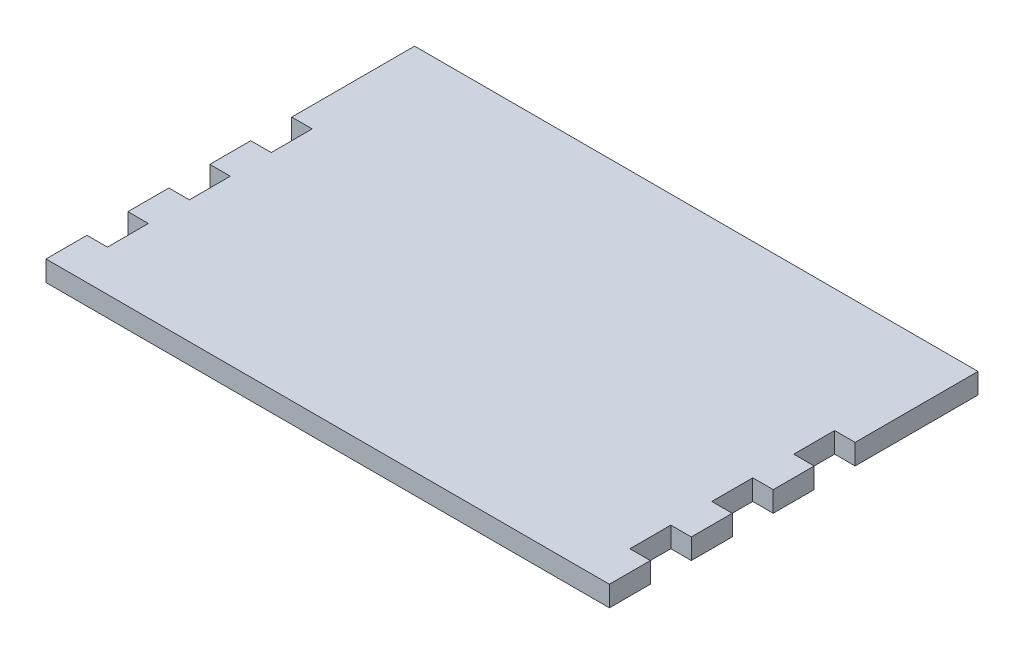
ISO-10303-21;
HEADER;
FILE_DESCRIPTION(('STEP AP214'),'2;1');
FILE_NAME('part.step','',(''),(''),'','','');
FILE_SCHEMA(('AUTOMOTIVE_DESIGN { 1 0 10303 214 1 1 1 1 }'));
ENDSEC;
DATA;
#1=APPLICATION_CONTEXT('core data for automotive mechanical design processes');
#2=APPLICATION_PROTOCOL_DEFINITION('international standard','automotive_design',2000,#1);
#3=PRODUCT_CONTEXT('',#1,'mechanical');
#4=PRODUCT('Part','Part','',(#3));
#5=PRODUCT_RELATED_PRODUCT_CATEGORY('part','',(#4));
#6=PRODUCT_DEFINITION_FORMATION('','',#4);
#7=PRODUCT_DEFINITION_CONTEXT('part definition',#1,'design');
#8=PRODUCT_DEFINITION('design','',#6,#7);
#9=PRODUCT_DEFINITION_SHAPE('','',#8);
#10=(LENGTH_UNIT() NAMED_UNIT(*) SI_UNIT(.MILLI.,.METRE.));
#11=(NAMED_UNIT(*) PLANE_ANGLE_UNIT() SI_UNIT($,.RADIAN.));
#12=(NAMED_UNIT(*) SI_UNIT($,.STERADIAN.) SOLID_ANGLE_UNIT());
#13=UNCERTAINTY_MEASURE_WITH_UNIT(LENGTH_MEASURE(1.E-05),#10,'distance_accuracy_value','');
#14=(GEOMETRIC_REPRESENTATION_CONTEXT(3) GLOBAL_UNCERTAINTY_ASSIGNED_CONTEXT((#13)) GLOBAL_UNIT_ASSIGNED_CONTEXT((#10,
#11,#12)) REPRESENTATION_CONTEXT('',''));
#15=CARTESIAN_POINT('',(0.,0.,0.));
#16=DIRECTION('',(0.,0.,1.));
#17=DIRECTION('',(1.,0.,0.));
#18=AXIS2_PLACEMENT_3D('',#15,#16,#17);
#19=CARTESIAN_POINT('',(81.0000000000001,3.175,-12.7));
#20=DIRECTION('',(0.,0.,-1.));
#21=DIRECTION('',(-1.,0.,0.));
#22=AXIS2_PLACEMENT_3D('',#19,#20,#21);
#23=PLANE('',#22);
#24=DIRECTION('',(1.,0.,0.));
#25=VECTOR('',#24,1.);
#26=CARTESIAN_POINT('',(81.0000000000001,0.,-12.7));
#27=LINE('',#26,#25);
#28=CARTESIAN_POINT('',(81.0000000000001,0.,-12.7));
#29=VERTEX_POINT('',#28);
#30=CARTESIAN_POINT('',(84.1750000000001,0.,-12.7));
#31=VERTEX_POINT('',#30);
#32=EDGE_CURVE('E249',#29,#31,#27,.T.);
#33=ORIENTED_EDGE('',*,*,#32,.T.);
#34=DIRECTION('',(0.,-1.,0.));
#35=VECTOR('',#34,1.);
#36=CARTESIAN_POINT('',(84.1750000000001,3.175,-12.7));
#37=LINE('',#36,#35);
#38=CARTESIAN_POINT('',(84.1750000000001,3.175,-12.7));
#39=VERTEX_POINT('',#38);
#40=EDGE_CURVE('E11',#39,#31,#37,.T.);
#41=ORIENTED_EDGE('',*,*,#40,.F.);
#42=DIRECTION('',(1.,0.,0.));
#43=VECTOR('',#42,1.);
#44=CARTESIAN_POINT('',(81.0000000000001,3.175,-12.7));
#45=LINE('',#44,#43);
#46=CARTESIAN_POINT('',(81.0000000000001,3.175,-12.7));
#47=VERTEX_POINT('',#46);
#48=EDGE_CURVE('E306',#47,#39,#45,.T.);
#49=ORIENTED_EDGE('',*,*,#48,.F.);
#50=DIRECTION('',(0.,-1.,0.));
#51=VECTOR('',#50,1.);
#52=CARTESIAN_POINT('',(81.0000000000001,3.175,-12.7));
#53=LINE('',#52,#51);
#54=EDGE_CURVE('E245',#47,#29,#53,.T.);
#55=ORIENTED_EDGE('',*,*,#54,.T.);
#56=EDGE_LOOP('',(#33,#41,#49,#55));
#57=FACE_BOUND('',#56,.T.);
#58=ADVANCED_FACE('F33',(#57),#23,.F.);
#59=CARTESIAN_POINT('',(84.1750000000001,3.175,-12.7));
#60=DIRECTION('',(-1.,0.,0.));
#61=DIRECTION('',(0.,0.,1.));
#62=AXIS2_PLACEMENT_3D('',#59,#60,#61);
#63=PLANE('',#62);
#64=DIRECTION('',(0.,0.,-1.));
#65=VECTOR('',#64,1.);
#66=CARTESIAN_POINT('',(84.1750000000001,0.,-12.7));
#67=LINE('',#66,#65);
#68=CARTESIAN_POINT('',(84.1750000000001,0.,-19.05));
#69=VERTEX_POINT('',#68);
#70=EDGE_CURVE('E252',#31,#69,#67,.T.);
#71=ORIENTED_EDGE('',*,*,#70,.T.);
#72=DIRECTION('',(0.,-1.,0.));
#73=VECTOR('',#72,1.);
#74=CARTESIAN_POINT('',(84.1750000000001,3.175,-19.05));
#75=LINE('',#74,#73);
#76=CARTESIAN_POINT('',(84.1750000000001,3.175,-19.05));
#77=VERTEX_POINT('',#76);
#78=EDGE_CURVE('E41',#77,#69,#75,.T.);
#79=ORIENTED_EDGE('',*,*,#78,.F.);
#80=DIRECTION('',(0.,0.,-1.));
#81=VECTOR('',#80,1.);
#82=CARTESIAN_POINT('',(84.1750000000001,3.175,-12.7));
#83=LINE('',#82,#81);
#84=EDGE_CURVE('E152',#39,#77,#83,.T.);
#85=ORIENTED_EDGE('',*,*,#84,.F.);
#86=ORIENTED_EDGE('',*,*,#40,.T.);
#87=EDGE_LOOP('',(#71,#79,#85,#86));
#88=FACE_BOUND('',#87,.T.);
#89=ADVANCED_FACE('F463',(#88),#63,.F.);
#90=CARTESIAN_POINT('',(84.1750000000001,3.175,-19.05));
#91=DIRECTION('',(0.,0.,1.));
#92=DIRECTION('',(1.,0.,0.));
#93=AXIS2_PLACEMENT_3D('',#90,#91,#92);
#94=PLANE('',#93);
#95=DIRECTION('',(-1.,0.,0.));
#96=VECTOR('',#95,1.);
#97=CARTESIAN_POINT('',(84.1750000000001,0.,-19.05));
#98=LINE('',#97,#96);
#99=CARTESIAN_POINT('',(81.0000000000001,0.,-19.05));
#100=VERTEX_POINT('',#99);
#101=EDGE_CURVE('E254',#69,#100,#98,.T.);
#102=ORIENTED_EDGE('',*,*,#101,.T.);
#103=DIRECTION('',(0.,-1.,0.));
#104=VECTOR('',#103,1.);
#105=CARTESIAN_POINT('',(81.0000000000001,3.175,-19.05));
#106=LINE('',#105,#104);
#107=CARTESIAN_POINT('',(81.0000000000001,3.175,-19.05));
#108=VERTEX_POINT('',#107);
#109=EDGE_CURVE('E373',#108,#100,#106,.T.);
#110=ORIENTED_EDGE('',*,*,#109,.F.);
#111=DIRECTION('',(-1.,0.,0.));
#112=VECTOR('',#111,1.);
#113=CARTESIAN_POINT('',(84.1750000000001,3.175,-19.05));
#114=LINE('',#113,#112);
#115=EDGE_CURVE('E381',#77,#108,#114,.T.);
#116=ORIENTED_EDGE('',*,*,#115,.F.);
#117=ORIENTED_EDGE('',*,*,#78,.T.);
#118=EDGE_LOOP('',(#102,#110,#116,#117));
#119=FACE_BOUND('',#118,.T.);
#120=ADVANCED_FACE('F379',(#119),#94,.F.);
#121=CARTESIAN_POINT('',(81.0000000000001,3.175,-19.05));
#122=DIRECTION('',(-1.,0.,0.));
#123=DIRECTION('',(0.,0.,1.));
#124=AXIS2_PLACEMENT_3D('',#121,#122,#123);
#125=PLANE('',#124);
#126=DIRECTION('',(0.,0.,-1.));
#127=VECTOR('',#126,1.);
#128=CARTESIAN_POINT('',(81.0000000000001,0.,-19.05));
#129=LINE('',#128,#127);
#130=CARTESIAN_POINT('',(81.0000000000002,0.,-25.4));
#131=VERTEX_POINT('',#130);
#132=EDGE_CURVE('E256',#100,#131,#129,.T.);
#133=ORIENTED_EDGE('',*,*,#132,.T.);
#134=DIRECTION('',(0.,-1.,0.));
#135=VECTOR('',#134,1.);
#136=CARTESIAN_POINT('',(81.0000000000002,3.175,-25.4));
#137=LINE('',#136,#135);
#138=CARTESIAN_POINT('',(81.0000000000002,3.175,-25.4));
#139=VERTEX_POINT('',#138);
#140=EDGE_CURVE('E370',#139,#131,#137,.T.);
#141=ORIENTED_EDGE('',*,*,#140,.F.);
#142=DIRECTION('',(0.,0.,-1.));
#143=VECTOR('',#142,1.);
#144=CARTESIAN_POINT('',(81.0000000000001,3.175,-19.05));
#145=LINE('',#144,#143);
#146=EDGE_CURVE('E399',#108,#139,#145,.T.);
#147=ORIENTED_EDGE('',*,*,#146,.F.);
#148=ORIENTED_EDGE('',*,*,#109,.T.);
#149=EDGE_LOOP('',(#133,#141,#147,#148));
#150=FACE_BOUND('',#149,.T.);
#151=ADVANCED_FACE('F390',(#150),#125,.F.);
#152=CARTESIAN_POINT('',(81.0000000000002,3.175,-25.4));
#153=DIRECTION('',(0.,0.,-1.));
#154=DIRECTION('',(-1.,0.,0.));
#155=AXIS2_PLACEMENT_3D('',#152,#153,#154);
#156=PLANE('',#155);
#157=DIRECTION('',(1.,0.,0.));
#158=VECTOR('',#157,1.);
#159=CARTESIAN_POINT('',(81.0000000000002,0.,-25.4));
#160=LINE('',#159,#158);
#161=CARTESIAN_POINT('',(84.1750000000002,0.,-25.4));
#162=VERTEX_POINT('',#161);
#163=EDGE_CURVE('E258',#131,#162,#160,.T.);
#164=ORIENTED_EDGE('',*,*,#163,.T.);
#165=DIRECTION('',(0.,-1.,0.));
#166=VECTOR('',#165,1.);
#167=CARTESIAN_POINT('',(84.1750000000002,3.175,-25.4));
#168=LINE('',#167,#166);
#169=CARTESIAN_POINT('',(84.1750000000002,3.175,-25.4));
#170=VERTEX_POINT('',#169);
#171=EDGE_CURVE('E367',#170,#162,#168,.T.);
#172=ORIENTED_EDGE('',*,*,#171,.F.);
#173=DIRECTION('',(1.,0.,0.));
#174=VECTOR('',#173,1.);
#175=CARTESIAN_POINT('',(81.0000000000002,3.175,-25.4));
#176=LINE('',#175,#174);
#177=EDGE_CURVE('E396',#139,#170,#176,.T.);
#178=ORIENTED_EDGE('',*,*,#177,.F.);
#179=ORIENTED_EDGE('',*,*,#140,.T.);
#180=EDGE_LOOP('',(#164,#172,#178,#179));
#181=FACE_BOUND('',#180,.T.);
#182=ADVANCED_FACE('F394',(#181),#156,.F.);
#183=CARTESIAN_POINT('',(84.1750000000002,3.175,-25.4));
#184=DIRECTION('',(-1.,0.,0.));
#185=DIRECTION('',(0.,0.,1.));
#186=AXIS2_PLACEMENT_3D('',#183,#184,#185);
#187=PLANE('',#186);
#188=DIRECTION('',(0.,0.,-1.));
#189=VECTOR('',#188,1.);
#190=CARTESIAN_POINT('',(84.1750000000002,0.,-25.4));
#191=LINE('',#190,#189);
#192=CARTESIAN_POINT('',(84.1750000000002,0.,-31.75));
#193=VERTEX_POINT('',#192);
#194=EDGE_CURVE('E260',#162,#193,#191,.T.);
#195=ORIENTED_EDGE('',*,*,#194,.T.);
#196=DIRECTION('',(0.,-1.,0.));
#197=VECTOR('',#196,1.);
#198=CARTESIAN_POINT('',(84.1750000000002,3.175,-31.75));
#199=LINE('',#198,#197);
#200=CARTESIAN_POINT('',(84.1750000000002,3.175,-31.75));
#201=VERTEX_POINT('',#200);
#202=EDGE_CURVE('E364',#201,#193,#199,.T.);
#203=ORIENTED_EDGE('',*,*,#202,.F.);
#204=DIRECTION('',(0.,0.,-1.));
#205=VECTOR('',#204,1.);
#206=CARTESIAN_POINT('',(84.1750000000002,3.175,-25.4));
#207=LINE('',#206,#205);
#208=EDGE_CURVE('E398',#170,#201,#207,.T.);
#209=ORIENTED_EDGE('',*,*,#208,.F.);
#210=ORIENTED_EDGE('',*,*,#171,.T.);
#211=EDGE_LOOP('',(#195,#203,#209,#210));
#212=FACE_BOUND('',#211,.T.);
#213=ADVANCED_FACE('F476',(#212),#187,.F.);
#214=CARTESIAN_POINT('',(84.1750000000002,3.175,-31.75));
#215=DIRECTION('',(0.,0.,1.));
#216=DIRECTION('',(1.,0.,0.));
#217=AXIS2_PLACEMENT_3D('',#214,#215,#216);
#218=PLANE('',#217);
#219=DIRECTION('',(-1.,0.,0.));
#220=VECTOR('',#219,1.);
#221=CARTESIAN_POINT('',(84.1750000000002,0.,-31.75));
#222=LINE('',#221,#220);
#223=CARTESIAN_POINT('',(81.0000000000002,0.,-31.75));
#224=VERTEX_POINT('',#223);
#225=EDGE_CURVE('E262',#193,#224,#222,.T.);
#226=ORIENTED_EDGE('',*,*,#225,.T.);
#227=DIRECTION('',(0.,-1.,0.));
#228=VECTOR('',#227,1.);
#229=CARTESIAN_POINT('',(81.0000000000002,3.175,-31.75));
#230=LINE('',#229,#228);
#231=CARTESIAN_POINT('',(81.0000000000002,3.175,-31.75));
#232=VERTEX_POINT('',#231);
#233=EDGE_CURVE('E361',#232,#224,#230,.T.);
#234=ORIENTED_EDGE('',*,*,#233,.F.);
#235=DIRECTION('',(-1.,0.,0.));
#236=VECTOR('',#235,1.);
#237=CARTESIAN_POINT('',(84.1750000000002,3.175,-31.75));
#238=LINE('',#237,#236);
#239=EDGE_CURVE('E401',#201,#232,#238,.T.);
#240=ORIENTED_EDGE('',*,*,#239,.F.);
#241=ORIENTED_EDGE('',*,*,#202,.T.);
#242=EDGE_LOOP('',(#226,#234,#240,#241));
#243=FACE_BOUND('',#242,.T.);
#244=ADVANCED_FACE('F479',(#243),#218,.F.);
#245=CARTESIAN_POINT('',(81.0000000000002,3.175,-31.75));
#246=DIRECTION('',(-1.,0.,0.));
#247=DIRECTION('',(0.,0.,1.));
#248=AXIS2_PLACEMENT_3D('',#245,#246,#247);
#249=PLANE('',#248);
#250=DIRECTION('',(0.,0.,-1.));
#251=VECTOR('',#250,1.);
#252=CARTESIAN_POINT('',(81.0000000000002,0.,-31.75));
#253=LINE('',#252,#251);
#254=CARTESIAN_POINT('',(81.0000000000002,0.,-38.1));
#255=VERTEX_POINT('',#254);
#256=EDGE_CURVE('E264',#224,#255,#253,.T.);
#257=ORIENTED_EDGE('',*,*,#256,.T.);
#258=DIRECTION('',(0.,-1.,0.));
#259=VECTOR('',#258,1.);
#260=CARTESIAN_POINT('',(81.0000000000002,3.175,-38.1));
#261=LINE('',#260,#259);
#262=CARTESIAN_POINT('',(81.0000000000002,3.175,-38.1));
#263=VERTEX_POINT('',#262);
#264=EDGE_CURVE('E358',#263,#255,#261,.T.);
#265=ORIENTED_EDGE('',*,*,#264,.F.);
#266=DIRECTION('',(0.,0.,-1.));
#267=VECTOR('',#266,1.);
#268=CARTESIAN_POINT('',(81.0000000000002,3.175,-31.75));
#269=LINE('',#268,#267);
#270=EDGE_CURVE('E407',#232,#263,#269,.T.);
#271=ORIENTED_EDGE('',*,*,#270,.F.);
#272=ORIENTED_EDGE('',*,*,#233,.T.);
#273=EDGE_LOOP('',(#257,#265,#271,#272));
#274=FACE_BOUND('',#273,.T.);
#275=ADVANCED_FACE('F483',(#274),#249,.F.);
#276=CARTESIAN_POINT('',(81.0000000000002,3.175,-38.1));
#277=DIRECTION('',(0.,0.,-1.));
#278=DIRECTION('',(-1.,0.,0.));
#279=AXIS2_PLACEMENT_3D('',#276,#277,#278);
#280=PLANE('',#279);
#281=DIRECTION('',(1.,0.,0.));
#282=VECTOR('',#281,1.);
#283=CARTESIAN_POINT('',(81.0000000000002,0.,-38.1));
#284=LINE('',#283,#282);
#285=CARTESIAN_POINT('',(84.1750000000002,0.,-38.1));
#286=VERTEX_POINT('',#285);
#287=EDGE_CURVE('E266',#255,#286,#284,.T.);
#288=ORIENTED_EDGE('',*,*,#287,.T.);
#289=DIRECTION('',(0.,-1.,0.));
#290=VECTOR('',#289,1.);
#291=CARTESIAN_POINT('',(84.1750000000002,3.175,-38.1));
#292=LINE('',#291,#290);
#293=CARTESIAN_POINT('',(84.1750000000002,3.175,-38.1));
#294=VERTEX_POINT('',#293);
#295=EDGE_CURVE('E355',#294,#286,#292,.T.);
#296=ORIENTED_EDGE('',*,*,#295,.F.);
#297=DIRECTION('',(1.,0.,0.));
#298=VECTOR('',#297,1.);
#299=CARTESIAN_POINT('',(81.0000000000002,3.175,-38.1));
#300=LINE('',#299,#298);
#301=EDGE_CURVE('E409',#263,#294,#300,.T.);
#302=ORIENTED_EDGE('',*,*,#301,.F.);
#303=ORIENTED_EDGE('',*,*,#264,.T.);
#304=EDGE_LOOP('',(#288,#296,#302,#303));
#305=FACE_BOUND('',#304,.T.);
#306=ADVANCED_FACE('F487',(#305),#280,.F.);
#307=CARTESIAN_POINT('',(84.175,3.175,-57.1499999999999));
#308=DIRECTION('',(-1.,0.,0.));
#309=DIRECTION('',(0.,0.,1.));
#310=AXIS2_PLACEMENT_3D('',#307,#308,#309);
#311=PLANE('',#310);
#312=DIRECTION('',(0.,0.,-1.));
#313=VECTOR('',#312,1.);
#314=CARTESIAN_POINT('',(84.175,0.,-57.1499999999999));
#315=LINE('',#314,#313);
#316=CARTESIAN_POINT('',(84.175,0.,-57.1499999999999));
#317=VERTEX_POINT('',#316);
#318=EDGE_CURVE('E269',#286,#317,#315,.T.);
#319=ORIENTED_EDGE('',*,*,#318,.T.);
#320=DIRECTION('',(0.,-1.,0.));
#321=VECTOR('',#320,1.);
#322=CARTESIAN_POINT('',(84.175,3.175,-57.1499999999999));
#323=LINE('',#322,#321);
#324=CARTESIAN_POINT('',(84.175,3.175,-57.1499999999999));
#325=VERTEX_POINT('',#324);
#326=EDGE_CURVE('E352',#325,#317,#323,.T.);
#327=ORIENTED_EDGE('',*,*,#326,.F.);
#328=DIRECTION('',(0.,0.,-1.));
#329=VECTOR('',#328,1.);
#330=CARTESIAN_POINT('',(84.1750000000002,3.175,-38.1));
#331=LINE('',#330,#329);
#332=EDGE_CURVE('E411',#294,#325,#331,.T.);
#333=ORIENTED_EDGE('',*,*,#332,.F.);
#334=ORIENTED_EDGE('',*,*,#295,.T.);
#335=EDGE_LOOP('',(#319,#327,#333,#334));
#336=FACE_BOUND('',#335,.T.);
#337=ADVANCED_FACE('F491',(#336),#311,.F.);
#338=CARTESIAN_POINT('',(-3.175,3.175,-57.1499999999999));
#339=DIRECTION('',(0.,0.,1.));
#340=DIRECTION('',(1.,0.,0.));
#341=AXIS2_PLACEMENT_3D('',#338,#339,#340);
#342=PLANE('',#341);
#343=DIRECTION('',(-1.,0.,0.));
#344=VECTOR('',#343,1.);
#345=CARTESIAN_POINT('',(-3.175,0.,-57.1499999999999));
#346=LINE('',#345,#344);
#347=CARTESIAN_POINT('',(-3.175,0.,-57.1499999999999));
#348=VERTEX_POINT('',#347);
#349=EDGE_CURVE('E271',#317,#348,#346,.T.);
#350=ORIENTED_EDGE('',*,*,#349,.T.);
#351=DIRECTION('',(0.,-1.,0.));
#352=VECTOR('',#351,1.);
#353=CARTESIAN_POINT('',(-3.175,3.175,-57.1499999999999));
#354=LINE('',#353,#352);
#355=CARTESIAN_POINT('',(-3.175,3.175,-57.1499999999999));
#356=VERTEX_POINT('',#355);
#357=EDGE_CURVE('E349',#356,#348,#354,.T.);
#358=ORIENTED_EDGE('',*,*,#357,.F.);
#359=DIRECTION('',(-1.,0.,0.));
#360=VECTOR('',#359,1.);
#361=CARTESIAN_POINT('',(-3.175,3.175,-57.1499999999999));
#362=LINE('',#361,#360);
#363=EDGE_CURVE('E413',#325,#356,#362,.T.);
#364=ORIENTED_EDGE('',*,*,#363,.F.);
#365=ORIENTED_EDGE('',*,*,#326,.T.);
#366=EDGE_LOOP('',(#350,#358,#364,#365));
#367=FACE_BOUND('',#366,.T.);
#368=ADVANCED_FACE('F495',(#367),#342,.F.);
#369=CARTESIAN_POINT('',(-3.17500000000025,3.175,-38.0999999999999));
#370=DIRECTION('',(1.,0.,0.));
#371=DIRECTION('',(0.,0.,-1.));
#372=AXIS2_PLACEMENT_3D('',#369,#370,#371);
#373=PLANE('',#372);
#374=DIRECTION('',(0.,0.,1.));
#375=VECTOR('',#374,1.);
#376=CARTESIAN_POINT('',(-3.17500000000025,0.,-38.0999999999999));
#377=LINE('',#376,#375);
#378=CARTESIAN_POINT('',(-3.17500000000025,0.,-38.0999999999999));
#379=VERTEX_POINT('',#378);
#380=EDGE_CURVE('E274',#348,#379,#377,.T.);
#381=ORIENTED_EDGE('',*,*,#380,.T.);
#382=DIRECTION('',(0.,-1.,0.));
#383=VECTOR('',#382,1.);
#384=CARTESIAN_POINT('',(-3.17500000000025,3.175,-38.0999999999999));
#385=LINE('',#384,#383);
#386=CARTESIAN_POINT('',(-3.17500000000025,3.175,-38.0999999999999));
#387=VERTEX_POINT('',#386);
#388=EDGE_CURVE('E346',#387,#379,#385,.T.);
#389=ORIENTED_EDGE('',*,*,#388,.F.);
#390=DIRECTION('',(0.,0.,1.));
#391=VECTOR('',#390,1.);
#392=CARTESIAN_POINT('',(-3.17500000000025,3.175,-44.4499999999999));
#393=LINE('',#392,#391);
#394=EDGE_CURVE('E415',#356,#387,#393,.T.);
#395=ORIENTED_EDGE('',*,*,#394,.F.);
#396=ORIENTED_EDGE('',*,*,#357,.T.);
#397=EDGE_LOOP('',(#381,#389,#395,#396));
#398=FACE_BOUND('',#397,.T.);
#399=ADVANCED_FACE('F499',(#398),#373,.F.);
#400=CARTESIAN_POINT('',(-2.49543419782172E-13,3.175,-38.0999999999999));
#401=DIRECTION('',(0.,0.,-1.));
#402=DIRECTION('',(-1.,0.,0.));
#403=AXIS2_PLACEMENT_3D('',#400,#401,#402);
#404=PLANE('',#403);
#405=DIRECTION('',(1.,0.,0.));
#406=VECTOR('',#405,1.);
#407=CARTESIAN_POINT('',(-2.49543419782172E-13,0.,-38.0999999999999));
#408=LINE('',#407,#406);
#409=CARTESIAN_POINT('',(-2.49543419782172E-13,0.,-38.0999999999999));
#410=VERTEX_POINT('',#409);
#411=EDGE_CURVE('E276',#379,#410,#408,.T.);
#412=ORIENTED_EDGE('',*,*,#411,.T.);
#413=DIRECTION('',(0.,-1.,0.));
#414=VECTOR('',#413,1.);
#415=CARTESIAN_POINT('',(-2.49543419782172E-13,3.175,-38.0999999999999));
#416=LINE('',#415,#414);
#417=CARTESIAN_POINT('',(-2.49543419782172E-13,3.175,-38.0999999999999));
#418=VERTEX_POINT('',#417);
#419=EDGE_CURVE('E343',#418,#410,#416,.T.);
#420=ORIENTED_EDGE('',*,*,#419,.F.);
#421=DIRECTION('',(1.,0.,0.));
#422=VECTOR('',#421,1.);
#423=CARTESIAN_POINT('',(-2.49543419782172E-13,3.175,-38.0999999999999));
#424=LINE('',#423,#422);
#425=EDGE_CURVE('E417',#387,#418,#424,.T.);
#426=ORIENTED_EDGE('',*,*,#425,.F.);
#427=ORIENTED_EDGE('',*,*,#388,.T.);
#428=EDGE_LOOP('',(#412,#420,#426,#427));
#429=FACE_BOUND('',#428,.T.);
#430=ADVANCED_FACE('F503',(#429),#404,.F.);
#431=CARTESIAN_POINT('',(-1.66362279854781E-13,3.175,-31.75));
#432=DIRECTION('',(1.,0.,0.));
#433=DIRECTION('',(0.,0.,-1.));
#434=AXIS2_PLACEMENT_3D('',#431,#432,#433);
#435=PLANE('',#434);
#436=DIRECTION('',(0.,0.,1.));
#437=VECTOR('',#436,1.);
#438=CARTESIAN_POINT('',(-1.66362279854781E-13,0.,-31.75));
#439=LINE('',#438,#437);
#440=CARTESIAN_POINT('',(-1.66362279854781E-13,0.,-31.75));
#441=VERTEX_POINT('',#440);
#442=EDGE_CURVE('E278',#410,#441,#439,.T.);
#443=ORIENTED_EDGE('',*,*,#442,.T.);
#444=DIRECTION('',(0.,-1.,0.));
#445=VECTOR('',#444,1.);
#446=CARTESIAN_POINT('',(-1.66362279854781E-13,3.175,-31.75));
#447=LINE('',#446,#445);
#448=CARTESIAN_POINT('',(-1.66362279854781E-13,3.175,-31.75));
#449=VERTEX_POINT('',#448);
#450=EDGE_CURVE('E340',#449,#441,#447,.T.);
#451=ORIENTED_EDGE('',*,*,#450,.F.);
#452=DIRECTION('',(0.,0.,1.));
#453=VECTOR('',#452,1.);
#454=CARTESIAN_POINT('',(-1.66362279854781E-13,3.175,-31.75));
#455=LINE('',#454,#453);
#456=EDGE_CURVE('E419',#418,#449,#455,.T.);
#457=ORIENTED_EDGE('',*,*,#456,.F.);
#458=ORIENTED_EDGE('',*,*,#419,.T.);
#459=EDGE_LOOP('',(#443,#451,#457,#458));
#460=FACE_BOUND('',#459,.T.);
#461=ADVANCED_FACE('F507',(#460),#435,.F.);
#462=CARTESIAN_POINT('',(-3.17500000000017,3.175,-31.75));
#463=DIRECTION('',(0.,0.,1.));
#464=DIRECTION('',(1.,0.,0.));
#465=AXIS2_PLACEMENT_3D('',#462,#463,#464);
#466=PLANE('',#465);
#467=DIRECTION('',(-1.,0.,0.));
#468=VECTOR('',#467,1.);
#469=CARTESIAN_POINT('',(-3.17500000000017,0.,-31.75));
#470=LINE('',#469,#468);
#471=CARTESIAN_POINT('',(-3.17500000000017,0.,-31.75));
#472=VERTEX_POINT('',#471);
#473=EDGE_CURVE('E280',#441,#472,#470,.T.);
#474=ORIENTED_EDGE('',*,*,#473,.T.);
#475=DIRECTION('',(0.,-1.,0.));
#476=VECTOR('',#475,1.);
#477=CARTESIAN_POINT('',(-3.17500000000017,3.175,-31.75));
#478=LINE('',#477,#476);
#479=CARTESIAN_POINT('',(-3.17500000000017,3.175,-31.75));
#480=VERTEX_POINT('',#479);
#481=EDGE_CURVE('E337',#480,#472,#478,.T.);
#482=ORIENTED_EDGE('',*,*,#481,.F.);
#483=DIRECTION('',(-1.,0.,0.));
#484=VECTOR('',#483,1.);
#485=CARTESIAN_POINT('',(-3.17500000000017,3.175,-31.75));
#486=LINE('',#485,#484);
#487=EDGE_CURVE('E421',#449,#480,#486,.T.);
#488=ORIENTED_EDGE('',*,*,#487,.F.);
#489=ORIENTED_EDGE('',*,*,#450,.T.);
#490=EDGE_LOOP('',(#474,#482,#488,#489));
#491=FACE_BOUND('',#490,.T.);
#492=ADVANCED_FACE('F511',(#491),#466,.F.);
#493=CARTESIAN_POINT('',(-3.17500000000017,3.175,-25.4));
#494=DIRECTION('',(1.,0.,0.));
#495=DIRECTION('',(0.,0.,-1.));
#496=AXIS2_PLACEMENT_3D('',#493,#494,#495);
#497=PLANE('',#496);
#498=DIRECTION('',(0.,0.,1.));
#499=VECTOR('',#498,1.);
#500=CARTESIAN_POINT('',(-3.17500000000017,0.,-25.4));
#501=LINE('',#500,#499);
#502=CARTESIAN_POINT('',(-3.17500000000017,0.,-25.4));
#503=VERTEX_POINT('',#502);
#504=EDGE_CURVE('E282',#472,#503,#501,.T.);
#505=ORIENTED_EDGE('',*,*,#504,.T.);
#506=DIRECTION('',(0.,-1.,0.));
#507=VECTOR('',#506,1.);
#508=CARTESIAN_POINT('',(-3.17500000000017,3.175,-25.4));
#509=LINE('',#508,#507);
#510=CARTESIAN_POINT('',(-3.17500000000017,3.175,-25.4));
#511=VERTEX_POINT('',#510);
#512=EDGE_CURVE('E334',#511,#503,#509,.T.);
#513=ORIENTED_EDGE('',*,*,#512,.F.);
#514=DIRECTION('',(0.,0.,1.));
#515=VECTOR('',#514,1.);
#516=CARTESIAN_POINT('',(-3.17500000000017,3.175,-25.4));
#517=LINE('',#516,#515);
#518=EDGE_CURVE('E423',#480,#511,#517,.T.);
#519=ORIENTED_EDGE('',*,*,#518,.F.);
#520=ORIENTED_EDGE('',*,*,#481,.T.);
#521=EDGE_LOOP('',(#505,#513,#519,#520));
#522=FACE_BOUND('',#521,.T.);
#523=ADVANCED_FACE('F515',(#522),#497,.F.);
#524=CARTESIAN_POINT('',(-1.66362279854781E-13,3.175,-25.4));
#525=DIRECTION('',(0.,0.,-1.));
#526=DIRECTION('',(-1.,0.,0.));
#527=AXIS2_PLACEMENT_3D('',#524,#525,#526);
#528=PLANE('',#527);
#529=DIRECTION('',(1.,0.,0.));
#530=VECTOR('',#529,1.);
#531=CARTESIAN_POINT('',(-1.66362279854781E-13,0.,-25.4));
#532=LINE('',#531,#530);
#533=CARTESIAN_POINT('',(-1.66362279854781E-13,0.,-25.4));
#534=VERTEX_POINT('',#533);
#535=EDGE_CURVE('E284',#503,#534,#532,.T.);
#536=ORIENTED_EDGE('',*,*,#535,.T.);
#537=DIRECTION('',(0.,-1.,0.));
#538=VECTOR('',#537,1.);
#539=CARTESIAN_POINT('',(-1.66362279854781E-13,3.175,-25.4));
#540=LINE('',#539,#538);
#541=CARTESIAN_POINT('',(-1.66362279854781E-13,3.175,-25.4));
#542=VERTEX_POINT('',#541);
#543=EDGE_CURVE('E331',#542,#534,#540,.T.);
#544=ORIENTED_EDGE('',*,*,#543,.F.);
#545=DIRECTION('',(1.,0.,0.));
#546=VECTOR('',#545,1.);
#547=CARTESIAN_POINT('',(-1.66362279854781E-13,3.175,-25.4));
#548=LINE('',#547,#546);
#549=EDGE_CURVE('E425',#511,#542,#548,.T.);
#550=ORIENTED_EDGE('',*,*,#549,.F.);
#551=ORIENTED_EDGE('',*,*,#512,.T.);
#552=EDGE_LOOP('',(#536,#544,#550,#551));
#553=FACE_BOUND('',#552,.T.);
#554=ADVANCED_FACE('F519',(#553),#528,.F.);
#555=CARTESIAN_POINT('',(0.,3.175,-19.05));
#556=DIRECTION('',(1.,0.,0.));
#557=DIRECTION('',(0.,0.,-1.));
#558=AXIS2_PLACEMENT_3D('',#555,#556,#557);
#559=PLANE('',#558);
#560=DIRECTION('',(0.,0.,1.));
#561=VECTOR('',#560,1.);
#562=CARTESIAN_POINT('',(0.,0.,-19.05));
#563=LINE('',#562,#561);
#564=CARTESIAN_POINT('',(0.,0.,-19.05));
#565=VERTEX_POINT('',#564);
#566=EDGE_CURVE('E286',#534,#565,#563,.T.);
#567=ORIENTED_EDGE('',*,*,#566,.T.);
#568=DIRECTION('',(0.,-1.,0.));
#569=VECTOR('',#568,1.);
#570=CARTESIAN_POINT('',(0.,3.175,-19.05));
#571=LINE('',#570,#569);
#572=CARTESIAN_POINT('',(0.,3.175,-19.05));
#573=VERTEX_POINT('',#572);
#574=EDGE_CURVE('E328',#573,#565,#571,.T.);
#575=ORIENTED_EDGE('',*,*,#574,.F.);
#576=DIRECTION('',(0.,0.,1.));
#577=VECTOR('',#576,1.);
#578=CARTESIAN_POINT('',(0.,3.175,-19.05));
#579=LINE('',#578,#577);
#580=EDGE_CURVE('E427',#542,#573,#579,.T.);
#581=ORIENTED_EDGE('',*,*,#580,.F.);
#582=ORIENTED_EDGE('',*,*,#543,.T.);
#583=EDGE_LOOP('',(#567,#575,#581,#582));
#584=FACE_BOUND('',#583,.T.);
#585=ADVANCED_FACE('F523',(#584),#559,.F.);
#586=CARTESIAN_POINT('',(-3.17500000000008,3.175,-19.05));
#587=DIRECTION('',(0.,0.,1.));
#588=DIRECTION('',(1.,0.,0.));
#589=AXIS2_PLACEMENT_3D('',#586,#587,#588);
#590=PLANE('',#589);
#591=DIRECTION('',(-1.,0.,0.));
#592=VECTOR('',#591,1.);
#593=CARTESIAN_POINT('',(-3.17500000000008,0.,-19.05));
#594=LINE('',#593,#592);
#595=CARTESIAN_POINT('',(-3.17500000000008,0.,-19.05));
#596=VERTEX_POINT('',#595);
#597=EDGE_CURVE('E288',#565,#596,#594,.T.);
#598=ORIENTED_EDGE('',*,*,#597,.T.);
#599=DIRECTION('',(0.,-1.,0.));
#600=VECTOR('',#599,1.);
#601=CARTESIAN_POINT('',(-3.17500000000008,3.175,-19.05));
#602=LINE('',#601,#600);
#603=CARTESIAN_POINT('',(-3.17500000000008,3.175,-19.05));
#604=VERTEX_POINT('',#603);
#605=EDGE_CURVE('E325',#604,#596,#602,.T.);
#606=ORIENTED_EDGE('',*,*,#605,.F.);
#607=DIRECTION('',(-1.,0.,0.));
#608=VECTOR('',#607,1.);
#609=CARTESIAN_POINT('',(-3.17500000000008,3.175,-19.05));
#610=LINE('',#609,#608);
#611=EDGE_CURVE('E429',#573,#604,#610,.T.);
#612=ORIENTED_EDGE('',*,*,#611,.F.);
#613=ORIENTED_EDGE('',*,*,#574,.T.);
#614=EDGE_LOOP('',(#598,#606,#612,#613));
#615=FACE_BOUND('',#614,.T.);
#616=ADVANCED_FACE('F527',(#615),#590,.F.);
#617=CARTESIAN_POINT('',(-3.17500000000008,3.175,-12.7));
#618=DIRECTION('',(1.,0.,0.));
#619=DIRECTION('',(0.,0.,-1.));
#620=AXIS2_PLACEMENT_3D('',#617,#618,#619);
#621=PLANE('',#620);
#622=DIRECTION('',(0.,0.,1.));
#623=VECTOR('',#622,1.);
#624=CARTESIAN_POINT('',(-3.17500000000008,0.,-12.7));
#625=LINE('',#624,#623);
#626=CARTESIAN_POINT('',(-3.17500000000008,0.,-12.7));
#627=VERTEX_POINT('',#626);
#628=EDGE_CURVE('E290',#596,#627,#625,.T.);
#629=ORIENTED_EDGE('',*,*,#628,.T.);
#630=DIRECTION('',(0.,-1.,0.));
#631=VECTOR('',#630,1.);
#632=CARTESIAN_POINT('',(-3.17500000000008,3.175,-12.7));
#633=LINE('',#632,#631);
#634=CARTESIAN_POINT('',(-3.17500000000008,3.175,-12.7));
#635=VERTEX_POINT('',#634);
#636=EDGE_CURVE('E322',#635,#627,#633,.T.);
#637=ORIENTED_EDGE('',*,*,#636,.F.);
#638=DIRECTION('',(0.,0.,1.));
#639=VECTOR('',#638,1.);
#640=CARTESIAN_POINT('',(-3.17500000000008,3.175,-12.7));
#641=LINE('',#640,#639);
#642=EDGE_CURVE('E431',#604,#635,#641,.T.);
#643=ORIENTED_EDGE('',*,*,#642,.F.);
#644=ORIENTED_EDGE('',*,*,#605,.T.);
#645=EDGE_LOOP('',(#629,#637,#643,#644));
#646=FACE_BOUND('',#645,.T.);
#647=ADVANCED_FACE('F531',(#646),#621,.F.);
#648=CARTESIAN_POINT('',(0.,3.175,-12.7));
#649=DIRECTION('',(0.,0.,-1.));
#650=DIRECTION('',(-1.,0.,0.));
#651=AXIS2_PLACEMENT_3D('',#648,#649,#650);
#652=PLANE('',#651);
#653=DIRECTION('',(1.,0.,0.));
#654=VECTOR('',#653,1.);
#655=CARTESIAN_POINT('',(0.,0.,-12.7));
#656=LINE('',#655,#654);
#657=CARTESIAN_POINT('',(0.,0.,-12.7));
#658=VERTEX_POINT('',#657);
#659=EDGE_CURVE('E292',#627,#658,#656,.T.);
#660=ORIENTED_EDGE('',*,*,#659,.T.);
#661=DIRECTION('',(0.,-1.,0.));
#662=VECTOR('',#661,1.);
#663=CARTESIAN_POINT('',(0.,3.175,-12.7));
#664=LINE('',#663,#662);
#665=CARTESIAN_POINT('',(0.,3.175,-12.7));
#666=VERTEX_POINT('',#665);
#667=EDGE_CURVE('E319',#666,#658,#664,.T.);
#668=ORIENTED_EDGE('',*,*,#667,.F.);
#669=DIRECTION('',(1.,0.,0.));
#670=VECTOR('',#669,1.);
#671=CARTESIAN_POINT('',(0.,3.175,-12.7));
#672=LINE('',#671,#670);
#673=EDGE_CURVE('E433',#635,#666,#672,.T.);
#674=ORIENTED_EDGE('',*,*,#673,.F.);
#675=ORIENTED_EDGE('',*,*,#636,.T.);
#676=EDGE_LOOP('',(#660,#668,#674,#675));
#677=FACE_BOUND('',#676,.T.);
#678=ADVANCED_FACE('F535',(#677),#652,.F.);
#679=CARTESIAN_POINT('',(0.,3.175,-6.35));
#680=DIRECTION('',(1.,0.,0.));
#681=DIRECTION('',(0.,0.,-1.));
#682=AXIS2_PLACEMENT_3D('',#679,#680,#681);
#683=PLANE('',#682);
#684=DIRECTION('',(0.,0.,1.));
#685=VECTOR('',#684,1.);
#686=CARTESIAN_POINT('',(0.,0.,-6.35));
#687=LINE('',#686,#685);
#688=CARTESIAN_POINT('',(0.,0.,-6.35));
#689=VERTEX_POINT('',#688);
#690=EDGE_CURVE('E294',#658,#689,#687,.T.);
#691=ORIENTED_EDGE('',*,*,#690,.T.);
#692=DIRECTION('',(0.,-1.,0.));
#693=VECTOR('',#692,1.);
#694=CARTESIAN_POINT('',(0.,3.175,-6.35));
#695=LINE('',#694,#693);
#696=CARTESIAN_POINT('',(0.,3.175,-6.35));
#697=VERTEX_POINT('',#696);
#698=EDGE_CURVE('E316',#697,#689,#695,.T.);
#699=ORIENTED_EDGE('',*,*,#698,.F.);
#700=DIRECTION('',(0.,0.,1.));
#701=VECTOR('',#700,1.);
#702=CARTESIAN_POINT('',(0.,3.175,-6.35));
#703=LINE('',#702,#701);
#704=EDGE_CURVE('E435',#666,#697,#703,.T.);
#705=ORIENTED_EDGE('',*,*,#704,.F.);
#706=ORIENTED_EDGE('',*,*,#667,.T.);
#707=EDGE_LOOP('',(#691,#699,#705,#706));
#708=FACE_BOUND('',#707,.T.);
#709=ADVANCED_FACE('F539',(#708),#683,.F.);
#710=CARTESIAN_POINT('',(-3.175,3.175,-6.35));
#711=DIRECTION('',(0.,0.,1.));
#712=DIRECTION('',(1.,0.,0.));
#713=AXIS2_PLACEMENT_3D('',#710,#711,#712);
#714=PLANE('',#713);
#715=DIRECTION('',(-1.,0.,0.));
#716=VECTOR('',#715,1.);
#717=CARTESIAN_POINT('',(-3.175,0.,-6.35));
#718=LINE('',#717,#716);
#719=CARTESIAN_POINT('',(-3.175,0.,-6.35));
#720=VERTEX_POINT('',#719);
#721=EDGE_CURVE('E296',#689,#720,#718,.T.);
#722=ORIENTED_EDGE('',*,*,#721,.T.);
#723=DIRECTION('',(0.,-1.,0.));
#724=VECTOR('',#723,1.);
#725=CARTESIAN_POINT('',(-3.175,3.175,-6.35));
#726=LINE('',#725,#724);
#727=CARTESIAN_POINT('',(-3.175,3.175,-6.35));
#728=VERTEX_POINT('',#727);
#729=EDGE_CURVE('E313',#728,#720,#726,.T.);
#730=ORIENTED_EDGE('',*,*,#729,.F.);
#731=DIRECTION('',(-1.,0.,0.));
#732=VECTOR('',#731,1.);
#733=CARTESIAN_POINT('',(-3.175,3.175,-6.35));
#734=LINE('',#733,#732);
#735=EDGE_CURVE('E437',#697,#728,#734,.T.);
#736=ORIENTED_EDGE('',*,*,#735,.F.);
#737=ORIENTED_EDGE('',*,*,#698,.T.);
#738=EDGE_LOOP('',(#722,#730,#736,#737));
#739=FACE_BOUND('',#738,.T.);
#740=ADVANCED_FACE('F543',(#739),#714,.F.);
#741=CARTESIAN_POINT('',(-3.175,3.175,0.));
#742=DIRECTION('',(1.,0.,0.));
#743=DIRECTION('',(0.,0.,-1.));
#744=AXIS2_PLACEMENT_3D('',#741,#742,#743);
#745=PLANE('',#744);
#746=DIRECTION('',(0.,0.,1.));
#747=VECTOR('',#746,1.);
#748=CARTESIAN_POINT('',(-3.175,0.,0.));
#749=LINE('',#748,#747);
#750=CARTESIAN_POINT('',(-3.175,0.,0.));
#751=VERTEX_POINT('',#750);
#752=EDGE_CURVE('E298',#720,#751,#749,.T.);
#753=ORIENTED_EDGE('',*,*,#752,.T.);
#754=DIRECTION('',(0.,-1.,0.));
#755=VECTOR('',#754,1.);
#756=CARTESIAN_POINT('',(-3.175,3.175,0.));
#757=LINE('',#756,#755);
#758=CARTESIAN_POINT('',(-3.175,3.175,0.));
#759=VERTEX_POINT('',#758);
#760=EDGE_CURVE('E310',#759,#751,#757,.T.);
#761=ORIENTED_EDGE('',*,*,#760,.F.);
#762=DIRECTION('',(0.,0.,1.));
#763=VECTOR('',#762,1.);
#764=CARTESIAN_POINT('',(-3.175,3.175,0.));
#765=LINE('',#764,#763);
#766=EDGE_CURVE('E439',#728,#759,#765,.T.);
#767=ORIENTED_EDGE('',*,*,#766,.F.);
#768=ORIENTED_EDGE('',*,*,#729,.T.);
#769=EDGE_LOOP('',(#753,#761,#767,#768));
#770=FACE_BOUND('',#769,.T.);
#771=ADVANCED_FACE('F445',(#770),#745,.F.);
#772=CARTESIAN_POINT('',(81.,3.175,0.));
#773=DIRECTION('',(0.,0.,-1.));
#774=DIRECTION('',(-1.,0.,0.));
#775=AXIS2_PLACEMENT_3D('',#772,#773,#774);
#776=PLANE('',#775);
#777=DIRECTION('',(1.,0.,0.));
#778=VECTOR('',#777,1.);
#779=CARTESIAN_POINT('',(81.,0.,0.));
#780=LINE('',#779,#778);
#781=CARTESIAN_POINT('',(84.175,0.,0.));
#782=VERTEX_POINT('',#781);
#783=EDGE_CURVE('E301',#751,#782,#780,.T.);
#784=ORIENTED_EDGE('',*,*,#783,.T.);
#785=DIRECTION('',(0.,-1.,0.));
#786=VECTOR('',#785,1.);
#787=CARTESIAN_POINT('',(84.175,3.175,0.));
#788=LINE('',#787,#786);
#789=CARTESIAN_POINT('',(84.175,3.175,0.));
#790=VERTEX_POINT('',#789);
#791=EDGE_CURVE('E240',#790,#782,#788,.T.);
#792=ORIENTED_EDGE('',*,*,#791,.F.);
#793=DIRECTION('',(1.,0.,0.));
#794=VECTOR('',#793,1.);
#795=CARTESIAN_POINT('',(0.,3.175,0.));
#796=LINE('',#795,#794);
#797=EDGE_CURVE('E231',#759,#790,#796,.T.);
#798=ORIENTED_EDGE('',*,*,#797,.F.);
#799=ORIENTED_EDGE('',*,*,#760,.T.);
#800=EDGE_LOOP('',(#784,#792,#798,#799));
#801=FACE_BOUND('',#800,.T.);
#802=ADVANCED_FACE('F448',(#801),#776,.F.);
#803=CARTESIAN_POINT('',(84.175,3.175,0.));
#804=DIRECTION('',(-1.,0.,0.));
#805=DIRECTION('',(0.,0.,1.));
#806=AXIS2_PLACEMENT_3D('',#803,#804,#805);
#807=PLANE('',#806);
#808=DIRECTION('',(0.,0.,-1.));
#809=VECTOR('',#808,1.);
#810=CARTESIAN_POINT('',(84.175,0.,0.));
#811=LINE('',#810,#809);
#812=CARTESIAN_POINT('',(84.175,0.,-6.35000000000001));
#813=VERTEX_POINT('',#812);
#814=EDGE_CURVE('E239',#782,#813,#811,.T.);
#815=ORIENTED_EDGE('',*,*,#814,.T.);
#816=DIRECTION('',(0.,-1.,0.));
#817=VECTOR('',#816,1.);
#818=CARTESIAN_POINT('',(84.175,3.175,-6.35000000000001));
#819=LINE('',#818,#817);
#820=CARTESIAN_POINT('',(84.175,3.175,-6.35000000000001));
#821=VERTEX_POINT('',#820);
#822=EDGE_CURVE('E236',#821,#813,#819,.T.);
#823=ORIENTED_EDGE('',*,*,#822,.F.);
#824=DIRECTION('',(0.,0.,-1.));
#825=VECTOR('',#824,1.);
#826=CARTESIAN_POINT('',(84.175,3.175,0.));
#827=LINE('',#826,#825);
#828=EDGE_CURVE('E225',#790,#821,#827,.T.);
#829=ORIENTED_EDGE('',*,*,#828,.F.);
#830=ORIENTED_EDGE('',*,*,#791,.T.);
#831=EDGE_LOOP('',(#815,#823,#829,#830));
#832=FACE_BOUND('',#831,.T.);
#833=ADVANCED_FACE('F237',(#832),#807,.F.);
#834=CARTESIAN_POINT('',(84.175,3.175,-6.35000000000001));
#835=DIRECTION('',(0.,0.,1.));
#836=DIRECTION('',(1.,0.,0.));
#837=AXIS2_PLACEMENT_3D('',#834,#835,#836);
#838=PLANE('',#837);
#839=DIRECTION('',(-1.,0.,0.));
#840=VECTOR('',#839,1.);
#841=CARTESIAN_POINT('',(84.175,0.,-6.35000000000001));
#842=LINE('',#841,#840);
#843=CARTESIAN_POINT('',(81.,0.,-6.35000000000001));
#844=VERTEX_POINT('',#843);
#845=EDGE_CURVE('E138',#813,#844,#842,.T.);
#846=ORIENTED_EDGE('',*,*,#845,.T.);
#847=DIRECTION('',(0.,-1.,0.));
#848=VECTOR('',#847,1.);
#849=CARTESIAN_POINT('',(81.,3.175,-6.35000000000001));
#850=LINE('',#849,#848);
#851=CARTESIAN_POINT('',(81.,3.175,-6.35000000000001));
#852=VERTEX_POINT('',#851);
#853=EDGE_CURVE('E241',#852,#844,#850,.T.);
#854=ORIENTED_EDGE('',*,*,#853,.F.);
#855=DIRECTION('',(-1.,0.,0.));
#856=VECTOR('',#855,1.);
#857=CARTESIAN_POINT('',(84.175,3.175,-6.35000000000001));
#858=LINE('',#857,#856);
#859=EDGE_CURVE('E229',#821,#852,#858,.T.);
#860=ORIENTED_EDGE('',*,*,#859,.F.);
#861=ORIENTED_EDGE('',*,*,#822,.T.);
#862=EDGE_LOOP('',(#846,#854,#860,#861));
#863=FACE_BOUND('',#862,.T.);
#864=ADVANCED_FACE('F243',(#863),#838,.F.);
#865=CARTESIAN_POINT('',(81.,3.175,-6.35000000000001));
#866=DIRECTION('',(-1.,0.,0.));
#867=DIRECTION('',(0.,0.,1.));
#868=AXIS2_PLACEMENT_3D('',#865,#866,#867);
#869=PLANE('',#868);
#870=DIRECTION('',(0.,0.,-1.));
#871=VECTOR('',#870,1.);
#872=CARTESIAN_POINT('',(81.,0.,-6.35000000000001));
#873=LINE('',#872,#871);
#874=EDGE_CURVE('E144',#844,#29,#873,.T.);
#875=ORIENTED_EDGE('',*,*,#874,.T.);
#876=ORIENTED_EDGE('',*,*,#54,.F.);
#877=DIRECTION('',(0.,0.,-1.));
#878=VECTOR('',#877,1.);
#879=CARTESIAN_POINT('',(81.,3.175,-6.35000000000001));
#880=LINE('',#879,#878);
#881=EDGE_CURVE('E49',#852,#47,#880,.T.);
#882=ORIENTED_EDGE('',*,*,#881,.F.);
#883=ORIENTED_EDGE('',*,*,#853,.T.);
#884=EDGE_LOOP('',(#875,#876,#882,#883));
#885=FACE_BOUND('',#884,.T.);
#886=ADVANCED_FACE('F452',(#885),#869,.F.);
#887=CARTESIAN_POINT('',(84.1750000000001,3.175,-12.7));
#888=DIRECTION('',(0.,1.,0.));
#889=DIRECTION('',(0.,0.,1.));
#890=AXIS2_PLACEMENT_3D('',#887,#888,#889);
#891=PLANE('',#890);
#892=ORIENTED_EDGE('',*,*,#48,.T.);
#893=ORIENTED_EDGE('',*,*,#84,.T.);
#894=ORIENTED_EDGE('',*,*,#115,.T.);
#895=ORIENTED_EDGE('',*,*,#146,.T.);
#896=ORIENTED_EDGE('',*,*,#177,.T.);
#897=ORIENTED_EDGE('',*,*,#208,.T.);
#898=ORIENTED_EDGE('',*,*,#239,.T.);
#899=ORIENTED_EDGE('',*,*,#270,.T.);
#900=ORIENTED_EDGE('',*,*,#301,.T.);
#901=ORIENTED_EDGE('',*,*,#332,.T.);
#902=ORIENTED_EDGE('',*,*,#363,.T.);
#903=ORIENTED_EDGE('',*,*,#394,.T.);
#904=ORIENTED_EDGE('',*,*,#425,.T.);
#905=ORIENTED_EDGE('',*,*,#456,.T.);
#906=ORIENTED_EDGE('',*,*,#487,.T.);
#907=ORIENTED_EDGE('',*,*,#518,.T.);
#908=ORIENTED_EDGE('',*,*,#549,.T.);
#909=ORIENTED_EDGE('',*,*,#580,.T.);
#910=ORIENTED_EDGE('',*,*,#611,.T.);
#911=ORIENTED_EDGE('',*,*,#642,.T.);
#912=ORIENTED_EDGE('',*,*,#673,.T.);
#913=ORIENTED_EDGE('',*,*,#704,.T.);
#914=ORIENTED_EDGE('',*,*,#735,.T.);
#915=ORIENTED_EDGE('',*,*,#766,.T.);
#916=ORIENTED_EDGE('',*,*,#797,.T.);
#917=ORIENTED_EDGE('',*,*,#828,.T.);
#918=ORIENTED_EDGE('',*,*,#859,.T.);
#919=ORIENTED_EDGE('',*,*,#881,.T.);
#920=EDGE_LOOP('',(#892,#893,#894,#895,#896,#897,#898,#899,#900,#901,#902,#903,#904,#905,#906,
#907,#908,#909,#910,#911,#912,#913,#914,#915,#916,#917,#918,#919));
#921=FACE_BOUND('',#920,.T.);
#922=ADVANCED_FACE('F227',(#921),#891,.T.);
#923=CARTESIAN_POINT('',(84.1750000000001,0.,-12.7));
#924=DIRECTION('',(0.,1.,0.));
#925=DIRECTION('',(0.,0.,1.));
#926=AXIS2_PLACEMENT_3D('',#923,#924,#925);
#927=PLANE('',#926);
#928=ORIENTED_EDGE('',*,*,#32,.F.);
#929=ORIENTED_EDGE('',*,*,#874,.F.);
#930=ORIENTED_EDGE('',*,*,#845,.F.);
#931=ORIENTED_EDGE('',*,*,#814,.F.);
#932=ORIENTED_EDGE('',*,*,#783,.F.);
#933=ORIENTED_EDGE('',*,*,#752,.F.);
#934=ORIENTED_EDGE('',*,*,#721,.F.);
#935=ORIENTED_EDGE('',*,*,#690,.F.);
#936=ORIENTED_EDGE('',*,*,#659,.F.);
#937=ORIENTED_EDGE('',*,*,#628,.F.);
#938=ORIENTED_EDGE('',*,*,#597,.F.);
#939=ORIENTED_EDGE('',*,*,#566,.F.);
#940=ORIENTED_EDGE('',*,*,#535,.F.);
#941=ORIENTED_EDGE('',*,*,#504,.F.);
#942=ORIENTED_EDGE('',*,*,#473,.F.);
#943=ORIENTED_EDGE('',*,*,#442,.F.);
#944=ORIENTED_EDGE('',*,*,#411,.F.);
#945=ORIENTED_EDGE('',*,*,#380,.F.);
#946=ORIENTED_EDGE('',*,*,#349,.F.);
#947=ORIENTED_EDGE('',*,*,#318,.F.);
#948=ORIENTED_EDGE('',*,*,#287,.F.);
#949=ORIENTED_EDGE('',*,*,#256,.F.);
#950=ORIENTED_EDGE('',*,*,#225,.F.);
#951=ORIENTED_EDGE('',*,*,#194,.F.);
#952=ORIENTED_EDGE('',*,*,#163,.F.);
#953=ORIENTED_EDGE('',*,*,#132,.F.);
#954=ORIENTED_EDGE('',*,*,#101,.F.);
#955=ORIENTED_EDGE('',*,*,#70,.F.);
#956=EDGE_LOOP('',(#928,#929,#930,#931,#932,#933,#934,#935,#936,#937,#938,#939,#940,#941,#942,
#943,#944,#945,#946,#947,#948,#949,#950,#951,#952,#953,#954,#955));
#957=FACE_BOUND('',#956,.T.);
#958=ADVANCED_FACE('F385',(#957),#927,.F.);
#959=CLOSED_SHELL('',(#58,#89,#120,#151,#182,#213,#244,#275,#306,#337,#368,#399,#430,#461,#492,
#523,#554,#585,#616,#647,#678,#709,#740,#771,#802,#833,#864,#886,#922,#958));
#960=MANIFOLD_SOLID_BREP('B2',#959);
#961=ADVANCED_BREP_SHAPE_REPRESENTATION('',(#18,#960),#14);
#962=SHAPE_DEFINITION_REPRESENTATION(#9,#961);
ENDSEC;
END-ISO-10303-21;
